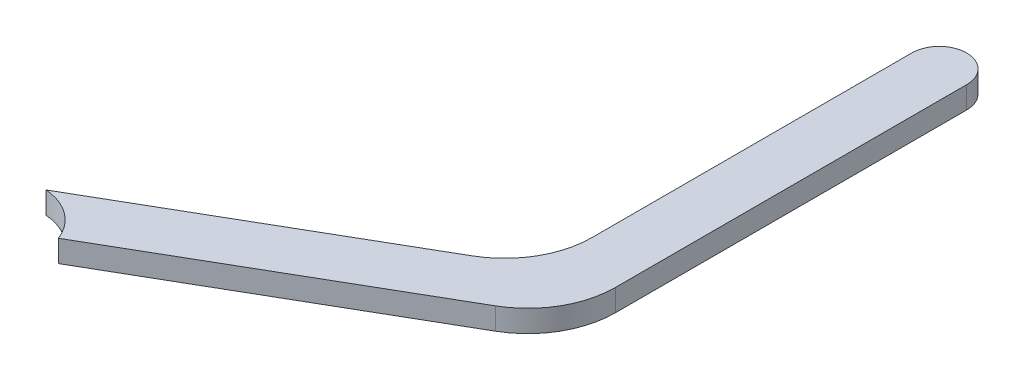
ISO-10303-21;
HEADER;
FILE_DESCRIPTION(('STEP AP214'),'2;1');
FILE_NAME('part.step','',(''),(''),'','','');
FILE_SCHEMA(('AUTOMOTIVE_DESIGN { 1 0 10303 214 1 1 1 1 }'));
ENDSEC;
DATA;
#1=APPLICATION_CONTEXT('core data for automotive mechanical design processes');
#2=APPLICATION_PROTOCOL_DEFINITION('international standard','automotive_design',2000,#1);
#3=PRODUCT_CONTEXT('',#1,'mechanical');
#4=PRODUCT('Part','Part','',(#3));
#5=PRODUCT_RELATED_PRODUCT_CATEGORY('part','',(#4));
#6=PRODUCT_DEFINITION_FORMATION('','',#4);
#7=PRODUCT_DEFINITION_CONTEXT('part definition',#1,'design');
#8=PRODUCT_DEFINITION('design','',#6,#7);
#9=PRODUCT_DEFINITION_SHAPE('','',#8);
#10=(LENGTH_UNIT() NAMED_UNIT(*) SI_UNIT(.MILLI.,.METRE.));
#11=(NAMED_UNIT(*) PLANE_ANGLE_UNIT() SI_UNIT($,.RADIAN.));
#12=(NAMED_UNIT(*) SI_UNIT($,.STERADIAN.) SOLID_ANGLE_UNIT());
#13=UNCERTAINTY_MEASURE_WITH_UNIT(LENGTH_MEASURE(1.E-05),#10,'distance_accuracy_value','');
#14=(GEOMETRIC_REPRESENTATION_CONTEXT(3) GLOBAL_UNCERTAINTY_ASSIGNED_CONTEXT((#13)) GLOBAL_UNIT_ASSIGNED_CONTEXT((#10,
#11,#12)) REPRESENTATION_CONTEXT('',''));
#15=CARTESIAN_POINT('',(0.,0.,0.));
#16=DIRECTION('',(0.,0.,1.));
#17=DIRECTION('',(1.,0.,0.));
#18=AXIS2_PLACEMENT_3D('',#15,#16,#17);
#19=CARTESIAN_POINT('',(-90.8935076670376,6.35,61.6428266425394));
#20=DIRECTION('',(-0.500000000000004,0.,-0.866025403784436));
#21=DIRECTION('',(-0.866025403784436,0.,0.500000000000004));
#22=AXIS2_PLACEMENT_3D('',#19,#20,#21);
#23=PLANE('',#22);
#24=DIRECTION('',(0.866025403784436,0.,-0.500000000000004));
#25=VECTOR('',#24,1.);
#26=CARTESIAN_POINT('',(-90.8935076670376,0.,61.6428266425394));
#27=LINE('',#26,#25);
#28=CARTESIAN_POINT('',(-84.9318322152041,0.,58.2008517156021));
#29=VERTEX_POINT('',#28);
#30=CARTESIAN_POINT('',(-4.76249999999986,0.,11.9150661804009));
#31=VERTEX_POINT('',#30);
#32=EDGE_CURVE('E112',#29,#31,#27,.T.);
#33=ORIENTED_EDGE('',*,*,#32,.T.);
#34=DIRECTION('',(0.,-1.,0.));
#35=VECTOR('',#34,1.);
#36=CARTESIAN_POINT('',(-4.76249999999986,6.35,11.9150661804009));
#37=LINE('',#36,#35);
#38=CARTESIAN_POINT('',(-4.76249999999986,6.35,11.9150661804009));
#39=VERTEX_POINT('',#38);
#40=EDGE_CURVE('E142',#31,#39,#37,.F.);
#41=ORIENTED_EDGE('',*,*,#40,.T.);
#42=DIRECTION('',(0.866025403784436,0.,-0.500000000000004));
#43=VECTOR('',#42,1.);
#44=CARTESIAN_POINT('',(-90.8935076670376,6.35,61.6428266425394));
#45=LINE('',#44,#43);
#46=CARTESIAN_POINT('',(-84.9318322152041,6.35,58.2008517156021));
#47=VERTEX_POINT('',#46);
#48=EDGE_CURVE('E115',#47,#39,#45,.T.);
#49=ORIENTED_EDGE('',*,*,#48,.F.);
#50=DIRECTION('',(0.,1.,0.));
#51=VECTOR('',#50,1.);
#52=CARTESIAN_POINT('',(-84.9318322152041,0.,58.2008517156021));
#53=LINE('',#52,#51);
#54=EDGE_CURVE('E100',#29,#47,#53,.T.);
#55=ORIENTED_EDGE('',*,*,#54,.F.);
#56=EDGE_LOOP('',(#33,#41,#49,#55));
#57=FACE_BOUND('',#56,.T.);
#58=ADVANCED_FACE('F32',(#57),#23,.F.);
#59=CARTESIAN_POINT('',(0.,6.35,-111.6203));
#60=DIRECTION('',(0.,-1.,0.));
#61=DIRECTION('',(0.,0.,-1.));
#62=AXIS2_PLACEMENT_3D('',#59,#60,#61);
#63=PLANE('',#62);
#64=ORIENTED_EDGE('',*,*,#48,.T.);
#65=CARTESIAN_POINT('',(-17.4625,6.35,-10.0819790757238));
#66=DIRECTION('',(0.,-1.,0.));
#67=DIRECTION('',(0.,0.,-1.));
#68=AXIS2_PLACEMENT_3D('',#65,#66,#67);
#69=CIRCLE('',#68,25.4);
#70=CARTESIAN_POINT('',(7.93750000000001,6.35,-10.0819790757238));
#71=VERTEX_POINT('',#70);
#72=EDGE_CURVE('E144',#39,#71,#69,.F.);
#73=ORIENTED_EDGE('',*,*,#72,.T.);
#74=DIRECTION('',(0.,0.,-1.));
#75=VECTOR('',#74,1.);
#76=CARTESIAN_POINT('',(7.9375,6.35,-111.6203));
#77=LINE('',#76,#75);
#78=CARTESIAN_POINT('',(7.9375,6.35,-111.6203));
#79=VERTEX_POINT('',#78);
#80=EDGE_CURVE('E133',#71,#79,#77,.T.);
#81=ORIENTED_EDGE('',*,*,#80,.T.);
#82=CARTESIAN_POINT('',(0.,6.35,-111.6203));
#83=DIRECTION('',(0.,1.,0.));
#84=DIRECTION('',(0.,0.,-1.));
#85=AXIS2_PLACEMENT_3D('',#82,#83,#84);
#86=CIRCLE('',#85,7.9375);
#87=CARTESIAN_POINT('',(-7.9375,6.35,-111.6203));
#88=VERTEX_POINT('',#87);
#89=EDGE_CURVE('E124',#79,#88,#86,.T.);
#90=ORIENTED_EDGE('',*,*,#89,.T.);
#91=DIRECTION('',(0.,0.,1.));
#92=VECTOR('',#91,1.);
#93=CARTESIAN_POINT('',(-7.9375,6.35,-111.6203));
#94=LINE('',#93,#92);
#95=CARTESIAN_POINT('',(-7.9375,6.35,-19.2474145991091));
#96=VERTEX_POINT('',#95);
#97=EDGE_CURVE('E158',#88,#96,#94,.T.);
#98=ORIENTED_EDGE('',*,*,#97,.T.);
#99=CARTESIAN_POINT('',(-33.3375,6.35,-19.2474145991091));
#100=DIRECTION('',(0.,-1.,0.));
#101=DIRECTION('',(0.,0.,-1.));
#102=AXIS2_PLACEMENT_3D('',#99,#100,#101);
#103=CIRCLE('',#102,25.4);
#104=CARTESIAN_POINT('',(-20.6374999999999,6.35,2.74963065701558));
#105=VERTEX_POINT('',#104);
#106=EDGE_CURVE('E11',#96,#105,#103,.T.);
#107=ORIENTED_EDGE('',*,*,#106,.T.);
#108=DIRECTION('',(-0.866025403784436,0.,0.500000000000005));
#109=VECTOR('',#108,1.);
#110=CARTESIAN_POINT('',(-98.8310076670377,6.35,47.8946733574615));
#111=LINE('',#110,#109);
#112=CARTESIAN_POINT('',(-98.8310076670377,6.35,47.8946733574615));
#113=VERTEX_POINT('',#112);
#114=EDGE_CURVE('E157',#105,#113,#111,.T.);
#115=ORIENTED_EDGE('',*,*,#114,.T.);
#116=CARTESIAN_POINT('',(-100.034341800716,6.35,64.0430012597286));
#117=DIRECTION('',(0.,1.,0.));
#118=DIRECTION('',(0.,0.,1.));
#119=AXIS2_PLACEMENT_3D('',#116,#117,#118);
#120=CIRCLE('',#119,16.1931006010712);
#121=EDGE_CURVE('E107',#113,#47,#120,.F.);
#122=ORIENTED_EDGE('',*,*,#121,.T.);
#123=EDGE_LOOP('',(#64,#73,#81,#90,#98,#107,#115,#122));
#124=FACE_BOUND('',#123,.T.);
#125=ADVANCED_FACE('F176',(#124),#63,.F.);
#126=CARTESIAN_POINT('',(0.,0.,-111.6203));
#127=DIRECTION('',(0.,-1.,0.));
#128=DIRECTION('',(0.,0.,-1.));
#129=AXIS2_PLACEMENT_3D('',#126,#127,#128);
#130=PLANE('',#129);
#131=DIRECTION('',(0.,0.,-1.));
#132=VECTOR('',#131,1.);
#133=CARTESIAN_POINT('',(7.9375,0.,-111.6203));
#134=LINE('',#133,#132);
#135=CARTESIAN_POINT('',(7.93750000000001,0.,-10.0819790757238));
#136=VERTEX_POINT('',#135);
#137=CARTESIAN_POINT('',(7.9375,0.,-111.6203));
#138=VERTEX_POINT('',#137);
#139=EDGE_CURVE('E121',#136,#138,#134,.T.);
#140=ORIENTED_EDGE('',*,*,#139,.F.);
#141=CARTESIAN_POINT('',(-17.4625,0.,-10.0819790757238));
#142=DIRECTION('',(0.,-1.,0.));
#143=DIRECTION('',(0.,0.,-1.));
#144=AXIS2_PLACEMENT_3D('',#141,#142,#143);
#145=CIRCLE('',#144,25.4);
#146=EDGE_CURVE('E120',#136,#31,#145,.T.);
#147=ORIENTED_EDGE('',*,*,#146,.T.);
#148=ORIENTED_EDGE('',*,*,#32,.F.);
#149=CARTESIAN_POINT('',(-100.034341800716,0.,64.0430012597286));
#150=DIRECTION('',(0.,1.,0.));
#151=DIRECTION('',(0.,0.,1.));
#152=AXIS2_PLACEMENT_3D('',#149,#150,#151);
#153=CIRCLE('',#152,16.1931006010712);
#154=CARTESIAN_POINT('',(-98.8310076670377,0.,47.8946733574615));
#155=VERTEX_POINT('',#154);
#156=EDGE_CURVE('E96',#155,#29,#153,.F.);
#157=ORIENTED_EDGE('',*,*,#156,.F.);
#158=DIRECTION('',(-0.866025403784436,0.,0.500000000000005));
#159=VECTOR('',#158,1.);
#160=CARTESIAN_POINT('',(-98.8310076670377,0.,47.8946733574615));
#161=LINE('',#160,#159);
#162=CARTESIAN_POINT('',(-20.6374999999999,0.,2.74963065701558));
#163=VERTEX_POINT('',#162);
#164=EDGE_CURVE('E122',#163,#155,#161,.T.);
#165=ORIENTED_EDGE('',*,*,#164,.F.);
#166=CARTESIAN_POINT('',(-33.3375,0.,-19.2474145991091));
#167=DIRECTION('',(0.,-1.,0.));
#168=DIRECTION('',(0.,0.,-1.));
#169=AXIS2_PLACEMENT_3D('',#166,#167,#168);
#170=CIRCLE('',#169,25.4);
#171=CARTESIAN_POINT('',(-7.9375,0.,-19.2474145991091));
#172=VERTEX_POINT('',#171);
#173=EDGE_CURVE('E40',#163,#172,#170,.F.);
#174=ORIENTED_EDGE('',*,*,#173,.T.);
#175=DIRECTION('',(0.,0.,1.));
#176=VECTOR('',#175,1.);
#177=CARTESIAN_POINT('',(-7.9375,0.,-111.6203));
#178=LINE('',#177,#176);
#179=CARTESIAN_POINT('',(-7.9375,0.,-111.6203));
#180=VERTEX_POINT('',#179);
#181=EDGE_CURVE('E126',#180,#172,#178,.T.);
#182=ORIENTED_EDGE('',*,*,#181,.F.);
#183=CARTESIAN_POINT('',(0.,0.,-111.6203));
#184=DIRECTION('',(0.,1.,0.));
#185=DIRECTION('',(0.,0.,-1.));
#186=AXIS2_PLACEMENT_3D('',#183,#184,#185);
#187=CIRCLE('',#186,7.9375);
#188=EDGE_CURVE('E116',#138,#180,#187,.T.);
#189=ORIENTED_EDGE('',*,*,#188,.F.);
#190=EDGE_LOOP('',(#140,#147,#148,#157,#165,#174,#182,#189));
#191=FACE_BOUND('',#190,.T.);
#192=ADVANCED_FACE('F119',(#191),#130,.T.);
#193=CARTESIAN_POINT('',(0.,6.35,-111.6203));
#194=DIRECTION('',(0.,-1.,0.));
#195=DIRECTION('',(0.,0.,-1.));
#196=AXIS2_PLACEMENT_3D('',#193,#194,#195);
#197=CYLINDRICAL_SURFACE('',#196,7.9375);
#198=ORIENTED_EDGE('',*,*,#188,.T.);
#199=DIRECTION('',(0.,-1.,0.));
#200=VECTOR('',#199,1.);
#201=CARTESIAN_POINT('',(-7.9375,6.35,-111.6203));
#202=LINE('',#201,#200);
#203=EDGE_CURVE('E135',#88,#180,#202,.T.);
#204=ORIENTED_EDGE('',*,*,#203,.F.);
#205=ORIENTED_EDGE('',*,*,#89,.F.);
#206=DIRECTION('',(0.,-1.,0.));
#207=VECTOR('',#206,1.);
#208=CARTESIAN_POINT('',(7.9375,6.35,-111.6203));
#209=LINE('',#208,#207);
#210=EDGE_CURVE('E130',#79,#138,#209,.T.);
#211=ORIENTED_EDGE('',*,*,#210,.T.);
#212=EDGE_LOOP('',(#198,#204,#205,#211));
#213=FACE_BOUND('',#212,.T.);
#214=ADVANCED_FACE('F166',(#213),#197,.T.);
#215=CARTESIAN_POINT('',(-7.9375,6.35,-111.6203));
#216=DIRECTION('',(1.,0.,0.));
#217=DIRECTION('',(0.,0.,-1.));
#218=AXIS2_PLACEMENT_3D('',#215,#216,#217);
#219=PLANE('',#218);
#220=ORIENTED_EDGE('',*,*,#181,.T.);
#221=DIRECTION('',(0.,-1.,0.));
#222=VECTOR('',#221,1.);
#223=CARTESIAN_POINT('',(-7.9375,6.35,-19.2474145991091));
#224=LINE('',#223,#222);
#225=EDGE_CURVE('E53',#172,#96,#224,.F.);
#226=ORIENTED_EDGE('',*,*,#225,.T.);
#227=ORIENTED_EDGE('',*,*,#97,.F.);
#228=ORIENTED_EDGE('',*,*,#203,.T.);
#229=EDGE_LOOP('',(#220,#226,#227,#228));
#230=FACE_BOUND('',#229,.T.);
#231=ADVANCED_FACE('F152',(#230),#219,.F.);
#232=CARTESIAN_POINT('',(-98.8310076670377,6.35,47.8946733574615));
#233=DIRECTION('',(0.500000000000005,0.,0.866025403784436));
#234=DIRECTION('',(0.866025403784436,0.,-0.500000000000005));
#235=AXIS2_PLACEMENT_3D('',#232,#233,#234);
#236=PLANE('',#235);
#237=ORIENTED_EDGE('',*,*,#114,.F.);
#238=DIRECTION('',(0.,-1.,0.));
#239=VECTOR('',#238,1.);
#240=CARTESIAN_POINT('',(-20.6374999999999,0.,2.74963065701558));
#241=LINE('',#240,#239);
#242=EDGE_CURVE('E146',#105,#163,#241,.T.);
#243=ORIENTED_EDGE('',*,*,#242,.T.);
#244=ORIENTED_EDGE('',*,*,#164,.T.);
#245=DIRECTION('',(0.,-1.,0.));
#246=VECTOR('',#245,1.);
#247=CARTESIAN_POINT('',(-98.8310076670377,6.35,47.8946733574615));
#248=LINE('',#247,#246);
#249=EDGE_CURVE('E103',#113,#155,#248,.T.);
#250=ORIENTED_EDGE('',*,*,#249,.F.);
#251=EDGE_LOOP('',(#237,#243,#244,#250));
#252=FACE_BOUND('',#251,.T.);
#253=ADVANCED_FACE('F156',(#252),#236,.F.);
#254=CARTESIAN_POINT('',(7.9375,6.35,-111.6203));
#255=DIRECTION('',(-1.,0.,0.));
#256=DIRECTION('',(0.,0.,1.));
#257=AXIS2_PLACEMENT_3D('',#254,#255,#256);
#258=PLANE('',#257);
#259=ORIENTED_EDGE('',*,*,#80,.F.);
#260=DIRECTION('',(0.,-1.,0.));
#261=VECTOR('',#260,1.);
#262=CARTESIAN_POINT('',(7.93750000000001,6.35,-10.0819790757238));
#263=LINE('',#262,#261);
#264=EDGE_CURVE('E138',#71,#136,#263,.T.);
#265=ORIENTED_EDGE('',*,*,#264,.T.);
#266=ORIENTED_EDGE('',*,*,#139,.T.);
#267=ORIENTED_EDGE('',*,*,#210,.F.);
#268=EDGE_LOOP('',(#259,#265,#266,#267));
#269=FACE_BOUND('',#268,.T.);
#270=ADVANCED_FACE('F171',(#269),#258,.F.);
#271=CARTESIAN_POINT('',(-100.034341800716,0.,64.0430012597286));
#272=DIRECTION('',(0.,1.,0.));
#273=DIRECTION('',(0.,0.,1.));
#274=AXIS2_PLACEMENT_3D('',#271,#272,#273);
#275=CYLINDRICAL_SURFACE('',#274,16.1931006010712);
#276=ORIENTED_EDGE('',*,*,#121,.F.);
#277=ORIENTED_EDGE('',*,*,#249,.T.);
#278=ORIENTED_EDGE('',*,*,#156,.T.);
#279=ORIENTED_EDGE('',*,*,#54,.T.);
#280=EDGE_LOOP('',(#276,#277,#278,#279));
#281=FACE_BOUND('',#280,.T.);
#282=ADVANCED_FACE('F99',(#281),#275,.F.);
#283=CARTESIAN_POINT('',(-17.4625,6.35,-10.0819790757238));
#284=DIRECTION('',(0.,-1.,0.));
#285=DIRECTION('',(0.,0.,-1.));
#286=AXIS2_PLACEMENT_3D('',#283,#284,#285);
#287=CYLINDRICAL_SURFACE('',#286,25.4);
#288=ORIENTED_EDGE('',*,*,#72,.F.);
#289=ORIENTED_EDGE('',*,*,#40,.F.);
#290=ORIENTED_EDGE('',*,*,#146,.F.);
#291=ORIENTED_EDGE('',*,*,#264,.F.);
#292=EDGE_LOOP('',(#288,#289,#290,#291));
#293=FACE_BOUND('',#292,.T.);
#294=ADVANCED_FACE('F175',(#293),#287,.T.);
#295=CARTESIAN_POINT('',(-33.3375,6.35,-19.2474145991091));
#296=DIRECTION('',(0.,1.,0.));
#297=DIRECTION('',(0.,0.,1.));
#298=AXIS2_PLACEMENT_3D('',#295,#296,#297);
#299=CYLINDRICAL_SURFACE('',#298,25.4);
#300=ORIENTED_EDGE('',*,*,#106,.F.);
#301=ORIENTED_EDGE('',*,*,#225,.F.);
#302=ORIENTED_EDGE('',*,*,#173,.F.);
#303=ORIENTED_EDGE('',*,*,#242,.F.);
#304=EDGE_LOOP('',(#300,#301,#302,#303));
#305=FACE_BOUND('',#304,.T.);
#306=ADVANCED_FACE('F34',(#305),#299,.F.);
#307=CLOSED_SHELL('',(#58,#125,#192,#214,#231,#253,#270,#282,#294,#306));
#308=MANIFOLD_SOLID_BREP('B2',#307);
#309=ADVANCED_BREP_SHAPE_REPRESENTATION('',(#18,#308),#14);
#310=SHAPE_DEFINITION_REPRESENTATION(#9,#309);
ENDSEC;
END-ISO-10303-21;
